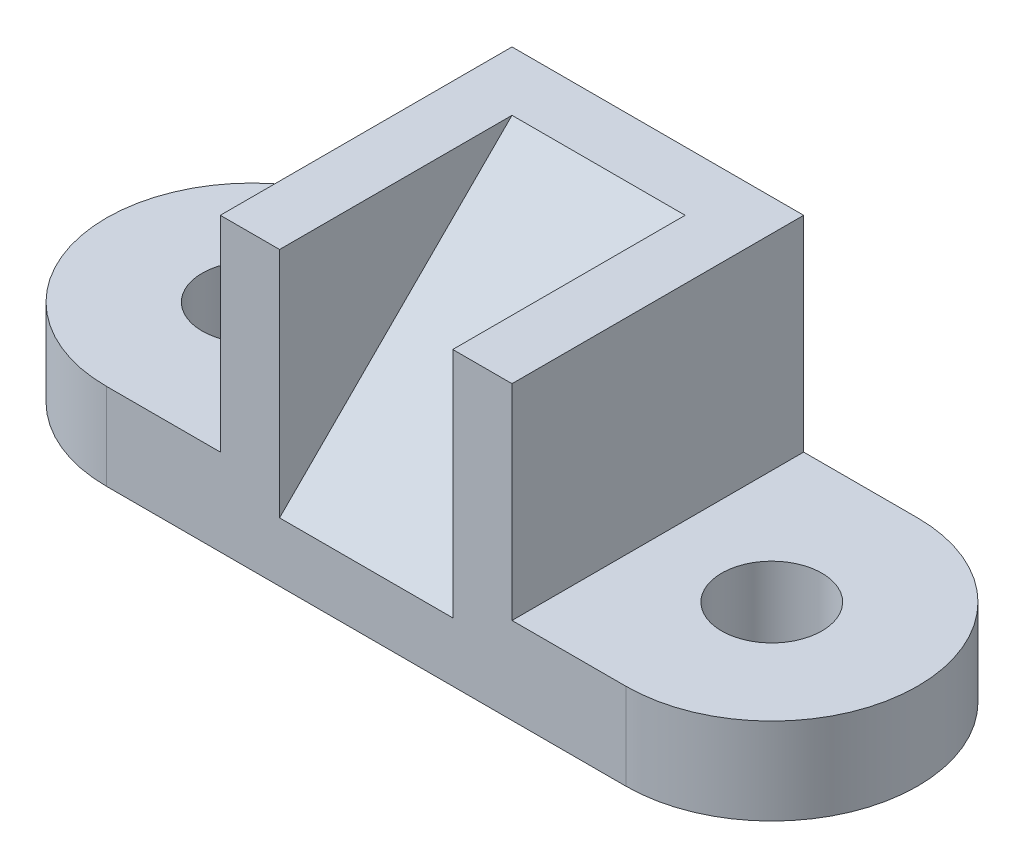
ISO-10303-21;
HEADER;
FILE_DESCRIPTION(('STEP AP214'),'2;1');
FILE_NAME('part.step','',(''),(''),'','','');
FILE_SCHEMA(('AUTOMOTIVE_DESIGN { 1 0 10303 214 1 1 1 1 }'));
ENDSEC;
DATA;
#1=APPLICATION_CONTEXT('core data for automotive mechanical design processes');
#2=APPLICATION_PROTOCOL_DEFINITION('international standard','automotive_design',2000,#1);
#3=PRODUCT_CONTEXT('',#1,'mechanical');
#4=PRODUCT('Part','Part','',(#3));
#5=PRODUCT_RELATED_PRODUCT_CATEGORY('part','',(#4));
#6=PRODUCT_DEFINITION_FORMATION('','',#4);
#7=PRODUCT_DEFINITION_CONTEXT('part definition',#1,'design');
#8=PRODUCT_DEFINITION('design','',#6,#7);
#9=PRODUCT_DEFINITION_SHAPE('','',#8);
#10=(LENGTH_UNIT() NAMED_UNIT(*) SI_UNIT(.MILLI.,.METRE.));
#11=(NAMED_UNIT(*) PLANE_ANGLE_UNIT() SI_UNIT($,.RADIAN.));
#12=(NAMED_UNIT(*) SI_UNIT($,.STERADIAN.) SOLID_ANGLE_UNIT());
#13=UNCERTAINTY_MEASURE_WITH_UNIT(LENGTH_MEASURE(1.E-05),#10,'distance_accuracy_value','');
#14=(GEOMETRIC_REPRESENTATION_CONTEXT(3) GLOBAL_UNCERTAINTY_ASSIGNED_CONTEXT((#13)) GLOBAL_UNIT_ASSIGNED_CONTEXT((#10,
#11,#12)) REPRESENTATION_CONTEXT('',''));
#15=CARTESIAN_POINT('',(0.,0.,0.));
#16=DIRECTION('',(0.,0.,1.));
#17=DIRECTION('',(1.,0.,0.));
#18=AXIS2_PLACEMENT_3D('',#15,#16,#17);
#19=CARTESIAN_POINT('',(-19.,13.,32.));
#20=DIRECTION('',(-1.,0.,0.));
#21=DIRECTION('',(0.,0.,1.));
#22=AXIS2_PLACEMENT_3D('',#19,#20,#21);
#23=PLANE('',#22);
#24=DIRECTION('',(0.,0.707106781186547,-0.707106781186548));
#25=VECTOR('',#24,1.);
#26=CARTESIAN_POINT('',(-19.,64.,-19.));
#27=LINE('',#26,#25);
#28=CARTESIAN_POINT('',(-19.,13.,32.));
#29=VERTEX_POINT('',#28);
#30=CARTESIAN_POINT('',(-19.,64.,-19.));
#31=VERTEX_POINT('',#30);
#32=EDGE_CURVE('E143',#29,#31,#27,.T.);
#33=ORIENTED_EDGE('',*,*,#32,.T.);
#34=DIRECTION('',(0.,0.,1.));
#35=VECTOR('',#34,1.);
#36=CARTESIAN_POINT('',(-19.,64.,32.));
#37=LINE('',#36,#35);
#38=CARTESIAN_POINT('',(-19.,64.,32.));
#39=VERTEX_POINT('',#38);
#40=EDGE_CURVE('E152',#31,#39,#37,.T.);
#41=ORIENTED_EDGE('',*,*,#40,.T.);
#42=DIRECTION('',(0.,1.,0.));
#43=VECTOR('',#42,1.);
#44=CARTESIAN_POINT('',(-19.,13.,32.));
#45=LINE('',#44,#43);
#46=EDGE_CURVE('E134',#29,#39,#45,.T.);
#47=ORIENTED_EDGE('',*,*,#46,.F.);
#48=EDGE_LOOP('',(#33,#41,#47));
#49=FACE_BOUND('',#48,.T.);
#50=ADVANCED_FACE('F43',(#49),#23,.F.);
#51=CARTESIAN_POINT('',(19.,13.,32.));
#52=DIRECTION('',(1.,0.,0.));
#53=DIRECTION('',(0.,0.,-1.));
#54=AXIS2_PLACEMENT_3D('',#51,#52,#53);
#55=PLANE('',#54);
#56=DIRECTION('',(0.,0.707106781186547,-0.707106781186548));
#57=VECTOR('',#56,1.);
#58=CARTESIAN_POINT('',(19.,64.,-19.));
#59=LINE('',#58,#57);
#60=CARTESIAN_POINT('',(19.,13.,32.));
#61=VERTEX_POINT('',#60);
#62=CARTESIAN_POINT('',(19.,64.,-19.));
#63=VERTEX_POINT('',#62);
#64=EDGE_CURVE('E137',#61,#63,#59,.T.);
#65=ORIENTED_EDGE('',*,*,#64,.F.);
#66=DIRECTION('',(0.,1.,0.));
#67=VECTOR('',#66,1.);
#68=CARTESIAN_POINT('',(19.,13.,32.));
#69=LINE('',#68,#67);
#70=CARTESIAN_POINT('',(19.,64.,32.));
#71=VERTEX_POINT('',#70);
#72=EDGE_CURVE('E58',#61,#71,#69,.T.);
#73=ORIENTED_EDGE('',*,*,#72,.T.);
#74=DIRECTION('',(0.,0.,-1.));
#75=VECTOR('',#74,1.);
#76=CARTESIAN_POINT('',(19.,64.,32.));
#77=LINE('',#76,#75);
#78=EDGE_CURVE('E139',#71,#63,#77,.T.);
#79=ORIENTED_EDGE('',*,*,#78,.T.);
#80=EDGE_LOOP('',(#65,#73,#79));
#81=FACE_BOUND('',#80,.T.);
#82=ADVANCED_FACE('F138',(#81),#55,.F.);
#83=CARTESIAN_POINT('',(0.,19.,0.));
#84=DIRECTION('',(0.,1.,0.));
#85=DIRECTION('',(0.,0.,1.));
#86=AXIS2_PLACEMENT_3D('',#83,#84,#85);
#87=PLANE('',#86);
#88=DIRECTION('',(0.,0.,1.));
#89=VECTOR('',#88,1.);
#90=CARTESIAN_POINT('',(-32.,19.,-32.));
#91=LINE('',#90,#89);
#92=CARTESIAN_POINT('',(-32.,19.,-32.));
#93=VERTEX_POINT('',#92);
#94=CARTESIAN_POINT('',(-32.,19.,32.));
#95=VERTEX_POINT('',#94);
#96=EDGE_CURVE('E133',#93,#95,#91,.T.);
#97=ORIENTED_EDGE('',*,*,#96,.F.);
#98=DIRECTION('',(-1.,0.,0.));
#99=VECTOR('',#98,1.);
#100=CARTESIAN_POINT('',(0.,19.,-32.));
#101=LINE('',#100,#99);
#102=CARTESIAN_POINT('',(-57.,19.,-32.));
#103=VERTEX_POINT('',#102);
#104=EDGE_CURVE('E184',#93,#103,#101,.T.);
#105=ORIENTED_EDGE('',*,*,#104,.T.);
#106=CARTESIAN_POINT('',(-57.,19.,0.));
#107=DIRECTION('',(0.,1.,0.));
#108=DIRECTION('',(0.,0.,1.));
#109=AXIS2_PLACEMENT_3D('',#106,#107,#108);
#110=CIRCLE('',#109,32.);
#111=CARTESIAN_POINT('',(-57.,19.,32.));
#112=VERTEX_POINT('',#111);
#113=EDGE_CURVE('E188',#103,#112,#110,.T.);
#114=ORIENTED_EDGE('',*,*,#113,.T.);
#115=DIRECTION('',(1.,0.,0.));
#116=VECTOR('',#115,1.);
#117=CARTESIAN_POINT('',(0.,19.,32.));
#118=LINE('',#117,#116);
#119=EDGE_CURVE('E191',#112,#95,#118,.T.);
#120=ORIENTED_EDGE('',*,*,#119,.T.);
#121=EDGE_LOOP('',(#97,#105,#114,#120));
#122=FACE_BOUND('',#121,.T.);
#123=CARTESIAN_POINT('',(-57.,19.,0.));
#124=DIRECTION('',(0.,1.,0.));
#125=DIRECTION('',(0.,0.,1.));
#126=AXIS2_PLACEMENT_3D('',#123,#124,#125);
#127=CIRCLE('',#126,11.);
#128=CARTESIAN_POINT('',(-57.,19.,11.));
#129=VERTEX_POINT('',#128);
#130=EDGE_CURVE('E181',#129,#129,#127,.T.);
#131=ORIENTED_EDGE('',*,*,#130,.F.);
#132=EDGE_LOOP('',(#131));
#133=FACE_BOUND('',#132,.T.);
#134=ADVANCED_FACE('F249',(#122,#133),#87,.T.);
#135=CARTESIAN_POINT('',(0.,19.,-32.));
#136=DIRECTION('',(0.,0.,1.));
#137=DIRECTION('',(1.,0.,0.));
#138=AXIS2_PLACEMENT_3D('',#135,#136,#137);
#139=PLANE('',#138);
#140=DIRECTION('',(-1.,0.,0.));
#141=VECTOR('',#140,1.);
#142=CARTESIAN_POINT('',(0.,0.,-32.));
#143=LINE('',#142,#141);
#144=CARTESIAN_POINT('',(57.,0.,-32.));
#145=VERTEX_POINT('',#144);
#146=CARTESIAN_POINT('',(-57.,0.,-32.));
#147=VERTEX_POINT('',#146);
#148=EDGE_CURVE('E202',#145,#147,#143,.T.);
#149=ORIENTED_EDGE('',*,*,#148,.T.);
#150=DIRECTION('',(0.,-1.,0.));
#151=VECTOR('',#150,1.);
#152=CARTESIAN_POINT('',(-57.,19.,-32.));
#153=LINE('',#152,#151);
#154=EDGE_CURVE('E11',#103,#147,#153,.T.);
#155=ORIENTED_EDGE('',*,*,#154,.F.);
#156=ORIENTED_EDGE('',*,*,#104,.F.);
#157=DIRECTION('',(0.,-1.,0.));
#158=VECTOR('',#157,1.);
#159=CARTESIAN_POINT('',(-32.,64.,-32.));
#160=LINE('',#159,#158);
#161=CARTESIAN_POINT('',(-32.,64.,-32.));
#162=VERTEX_POINT('',#161);
#163=EDGE_CURVE('E165',#162,#93,#160,.T.);
#164=ORIENTED_EDGE('',*,*,#163,.F.);
#165=DIRECTION('',(-1.,0.,0.));
#166=VECTOR('',#165,1.);
#167=CARTESIAN_POINT('',(-32.,64.,-32.));
#168=LINE('',#167,#166);
#169=CARTESIAN_POINT('',(32.,64.,-32.));
#170=VERTEX_POINT('',#169);
#171=EDGE_CURVE('E163',#170,#162,#168,.T.);
#172=ORIENTED_EDGE('',*,*,#171,.F.);
#173=DIRECTION('',(0.,-1.,0.));
#174=VECTOR('',#173,1.);
#175=CARTESIAN_POINT('',(32.,64.,-32.));
#176=LINE('',#175,#174);
#177=CARTESIAN_POINT('',(32.,19.,-32.));
#178=VERTEX_POINT('',#177);
#179=EDGE_CURVE('E171',#170,#178,#176,.T.);
#180=ORIENTED_EDGE('',*,*,#179,.T.);
#181=CARTESIAN_POINT('',(57.,19.,-32.));
#182=VERTEX_POINT('',#181);
#183=EDGE_CURVE('E186',#182,#178,#101,.T.);
#184=ORIENTED_EDGE('',*,*,#183,.F.);
#185=DIRECTION('',(0.,-1.,0.));
#186=VECTOR('',#185,1.);
#187=CARTESIAN_POINT('',(57.,19.,-32.));
#188=LINE('',#187,#186);
#189=EDGE_CURVE('E199',#182,#145,#188,.T.);
#190=ORIENTED_EDGE('',*,*,#189,.T.);
#191=EDGE_LOOP('',(#149,#155,#156,#164,#172,#180,#184,#190));
#192=FACE_BOUND('',#191,.T.);
#193=ADVANCED_FACE('F253',(#192),#139,.F.);
#194=CARTESIAN_POINT('',(-57.,19.,0.));
#195=DIRECTION('',(0.,-1.,0.));
#196=DIRECTION('',(0.,0.,-1.));
#197=AXIS2_PLACEMENT_3D('',#194,#195,#196);
#198=CYLINDRICAL_SURFACE('',#197,32.);
#199=CARTESIAN_POINT('',(-57.,0.,0.));
#200=DIRECTION('',(0.,1.,0.));
#201=DIRECTION('',(0.,0.,1.));
#202=AXIS2_PLACEMENT_3D('',#199,#200,#201);
#203=CIRCLE('',#202,32.);
#204=CARTESIAN_POINT('',(-57.,0.,32.));
#205=VERTEX_POINT('',#204);
#206=EDGE_CURVE('E205',#147,#205,#203,.T.);
#207=ORIENTED_EDGE('',*,*,#206,.T.);
#208=DIRECTION('',(0.,-1.,0.));
#209=VECTOR('',#208,1.);
#210=CARTESIAN_POINT('',(-57.,19.,32.));
#211=LINE('',#210,#209);
#212=EDGE_CURVE('E51',#112,#205,#211,.T.);
#213=ORIENTED_EDGE('',*,*,#212,.F.);
#214=ORIENTED_EDGE('',*,*,#113,.F.);
#215=ORIENTED_EDGE('',*,*,#154,.T.);
#216=EDGE_LOOP('',(#207,#213,#214,#215));
#217=FACE_BOUND('',#216,.T.);
#218=ADVANCED_FACE('F254',(#217),#198,.T.);
#219=CARTESIAN_POINT('',(0.,19.,32.));
#220=DIRECTION('',(0.,0.,-1.));
#221=DIRECTION('',(-1.,0.,0.));
#222=AXIS2_PLACEMENT_3D('',#219,#220,#221);
#223=PLANE('',#222);
#224=DIRECTION('',(1.,0.,0.));
#225=VECTOR('',#224,1.);
#226=CARTESIAN_POINT('',(-19.,13.,32.));
#227=LINE('',#226,#225);
#228=EDGE_CURVE('E129',#29,#61,#227,.T.);
#229=ORIENTED_EDGE('',*,*,#228,.F.);
#230=ORIENTED_EDGE('',*,*,#46,.T.);
#231=DIRECTION('',(1.,0.,0.));
#232=VECTOR('',#231,1.);
#233=CARTESIAN_POINT('',(-32.,64.,32.));
#234=LINE('',#233,#232);
#235=CARTESIAN_POINT('',(-32.,64.,32.));
#236=VERTEX_POINT('',#235);
#237=EDGE_CURVE('E158',#236,#39,#234,.T.);
#238=ORIENTED_EDGE('',*,*,#237,.F.);
#239=DIRECTION('',(0.,-1.,0.));
#240=VECTOR('',#239,1.);
#241=CARTESIAN_POINT('',(-32.,64.,32.));
#242=LINE('',#241,#240);
#243=EDGE_CURVE('E177',#236,#95,#242,.T.);
#244=ORIENTED_EDGE('',*,*,#243,.T.);
#245=ORIENTED_EDGE('',*,*,#119,.F.);
#246=ORIENTED_EDGE('',*,*,#212,.T.);
#247=DIRECTION('',(1.,0.,0.));
#248=VECTOR('',#247,1.);
#249=CARTESIAN_POINT('',(0.,0.,32.));
#250=LINE('',#249,#248);
#251=CARTESIAN_POINT('',(57.,0.,32.));
#252=VERTEX_POINT('',#251);
#253=EDGE_CURVE('E207',#205,#252,#250,.T.);
#254=ORIENTED_EDGE('',*,*,#253,.T.);
#255=DIRECTION('',(0.,-1.,0.));
#256=VECTOR('',#255,1.);
#257=CARTESIAN_POINT('',(57.,19.,32.));
#258=LINE('',#257,#256);
#259=CARTESIAN_POINT('',(57.,19.,32.));
#260=VERTEX_POINT('',#259);
#261=EDGE_CURVE('E216',#260,#252,#258,.T.);
#262=ORIENTED_EDGE('',*,*,#261,.F.);
#263=CARTESIAN_POINT('',(32.,19.,32.));
#264=VERTEX_POINT('',#263);
#265=EDGE_CURVE('E190',#264,#260,#118,.T.);
#266=ORIENTED_EDGE('',*,*,#265,.F.);
#267=DIRECTION('',(0.,-1.,0.));
#268=VECTOR('',#267,1.);
#269=CARTESIAN_POINT('',(32.,64.,32.));
#270=LINE('',#269,#268);
#271=CARTESIAN_POINT('',(32.,64.,32.));
#272=VERTEX_POINT('',#271);
#273=EDGE_CURVE('E174',#272,#264,#270,.T.);
#274=ORIENTED_EDGE('',*,*,#273,.F.);
#275=EDGE_CURVE('E132',#71,#272,#234,.T.);
#276=ORIENTED_EDGE('',*,*,#275,.F.);
#277=ORIENTED_EDGE('',*,*,#72,.F.);
#278=EDGE_LOOP('',(#229,#230,#238,#244,#245,#246,#254,#262,#266,#274,#276,#277));
#279=FACE_BOUND('',#278,.T.);
#280=ADVANCED_FACE('F126',(#279),#223,.F.);
#281=CARTESIAN_POINT('',(57.,19.,0.));
#282=DIRECTION('',(0.,-1.,0.));
#283=DIRECTION('',(0.,0.,-1.));
#284=AXIS2_PLACEMENT_3D('',#281,#282,#283);
#285=CYLINDRICAL_SURFACE('',#284,32.);
#286=CARTESIAN_POINT('',(57.,0.,0.));
#287=DIRECTION('',(0.,1.,0.));
#288=DIRECTION('',(0.,0.,1.));
#289=AXIS2_PLACEMENT_3D('',#286,#287,#288);
#290=CIRCLE('',#289,32.);
#291=EDGE_CURVE('E210',#145,#252,#290,.F.);
#292=ORIENTED_EDGE('',*,*,#291,.F.);
#293=ORIENTED_EDGE('',*,*,#189,.F.);
#294=CARTESIAN_POINT('',(57.,19.,0.));
#295=DIRECTION('',(0.,1.,0.));
#296=DIRECTION('',(0.,0.,1.));
#297=AXIS2_PLACEMENT_3D('',#294,#295,#296);
#298=CIRCLE('',#297,32.);
#299=EDGE_CURVE('E193',#182,#260,#298,.F.);
#300=ORIENTED_EDGE('',*,*,#299,.T.);
#301=ORIENTED_EDGE('',*,*,#261,.T.);
#302=EDGE_LOOP('',(#292,#293,#300,#301));
#303=FACE_BOUND('',#302,.T.);
#304=ADVANCED_FACE('F230',(#303),#285,.T.);
#305=CARTESIAN_POINT('',(-57.,19.,0.));
#306=DIRECTION('',(0.,-1.,0.));
#307=DIRECTION('',(0.,0.,-1.));
#308=AXIS2_PLACEMENT_3D('',#305,#306,#307);
#309=CYLINDRICAL_SURFACE('',#308,11.);
#310=ORIENTED_EDGE('',*,*,#130,.T.);
#311=EDGE_LOOP('',(#310));
#312=FACE_BOUND('',#311,.T.);
#313=CARTESIAN_POINT('',(-57.,0.,0.));
#314=DIRECTION('',(0.,1.,0.));
#315=DIRECTION('',(0.,0.,1.));
#316=AXIS2_PLACEMENT_3D('',#313,#314,#315);
#317=CIRCLE('',#316,11.);
#318=CARTESIAN_POINT('',(-57.,0.,11.));
#319=VERTEX_POINT('',#318);
#320=EDGE_CURVE('E180',#319,#319,#317,.T.);
#321=ORIENTED_EDGE('',*,*,#320,.F.);
#322=EDGE_LOOP('',(#321));
#323=FACE_BOUND('',#322,.T.);
#324=ADVANCED_FACE('F45',(#312,#323),#309,.F.);
#325=CARTESIAN_POINT('',(57.,19.,0.));
#326=DIRECTION('',(0.,-1.,0.));
#327=DIRECTION('',(0.,0.,-1.));
#328=AXIS2_PLACEMENT_3D('',#325,#326,#327);
#329=CYLINDRICAL_SURFACE('',#328,11.);
#330=CARTESIAN_POINT('',(57.,19.,0.));
#331=DIRECTION('',(0.,1.,0.));
#332=DIRECTION('',(0.,0.,1.));
#333=AXIS2_PLACEMENT_3D('',#330,#331,#332);
#334=CIRCLE('',#333,11.);
#335=CARTESIAN_POINT('',(57.,19.,11.));
#336=VERTEX_POINT('',#335);
#337=EDGE_CURVE('E196',#336,#336,#334,.F.);
#338=ORIENTED_EDGE('',*,*,#337,.F.);
#339=EDGE_LOOP('',(#338));
#340=FACE_BOUND('',#339,.T.);
#341=CARTESIAN_POINT('',(57.,0.,0.));
#342=DIRECTION('',(0.,1.,0.));
#343=DIRECTION('',(0.,0.,1.));
#344=AXIS2_PLACEMENT_3D('',#341,#342,#343);
#345=CIRCLE('',#344,11.);
#346=CARTESIAN_POINT('',(57.,0.,11.));
#347=VERTEX_POINT('',#346);
#348=EDGE_CURVE('E185',#347,#347,#345,.F.);
#349=ORIENTED_EDGE('',*,*,#348,.T.);
#350=EDGE_LOOP('',(#349));
#351=FACE_BOUND('',#350,.T.);
#352=ADVANCED_FACE('F280',(#340,#351),#329,.F.);
#353=DIRECTION('',(0.,0.,-1.));
#354=VECTOR('',#353,1.);
#355=CARTESIAN_POINT('',(32.,19.,-32.));
#356=LINE('',#355,#354);
#357=EDGE_CURVE('E66',#264,#178,#356,.T.);
#358=ORIENTED_EDGE('',*,*,#357,.F.);
#359=ORIENTED_EDGE('',*,*,#265,.T.);
#360=ORIENTED_EDGE('',*,*,#299,.F.);
#361=ORIENTED_EDGE('',*,*,#183,.T.);
#362=EDGE_LOOP('',(#358,#359,#360,#361));
#363=FACE_BOUND('',#362,.T.);
#364=ORIENTED_EDGE('',*,*,#337,.T.);
#365=EDGE_LOOP('',(#364));
#366=FACE_BOUND('',#365,.T.);
#367=ADVANCED_FACE('F277',(#363,#366),#87,.T.);
#368=CARTESIAN_POINT('',(0.,0.,0.));
#369=DIRECTION('',(0.,1.,0.));
#370=DIRECTION('',(0.,0.,1.));
#371=AXIS2_PLACEMENT_3D('',#368,#369,#370);
#372=PLANE('',#371);
#373=ORIENTED_EDGE('',*,*,#320,.T.);
#374=EDGE_LOOP('',(#373));
#375=FACE_BOUND('',#374,.T.);
#376=ORIENTED_EDGE('',*,*,#148,.F.);
#377=ORIENTED_EDGE('',*,*,#291,.T.);
#378=ORIENTED_EDGE('',*,*,#253,.F.);
#379=ORIENTED_EDGE('',*,*,#206,.F.);
#380=EDGE_LOOP('',(#376,#377,#378,#379));
#381=FACE_BOUND('',#380,.T.);
#382=ORIENTED_EDGE('',*,*,#348,.F.);
#383=EDGE_LOOP('',(#382));
#384=FACE_BOUND('',#383,.T.);
#385=ADVANCED_FACE('F226',(#375,#381,#384),#372,.F.);
#386=CARTESIAN_POINT('',(-32.,64.,-32.));
#387=DIRECTION('',(1.,0.,0.));
#388=DIRECTION('',(0.,0.,-1.));
#389=AXIS2_PLACEMENT_3D('',#386,#387,#388);
#390=PLANE('',#389);
#391=ORIENTED_EDGE('',*,*,#96,.T.);
#392=ORIENTED_EDGE('',*,*,#243,.F.);
#393=DIRECTION('',(0.,0.,1.));
#394=VECTOR('',#393,1.);
#395=CARTESIAN_POINT('',(-32.,64.,-32.));
#396=LINE('',#395,#394);
#397=EDGE_CURVE('E155',#162,#236,#396,.T.);
#398=ORIENTED_EDGE('',*,*,#397,.F.);
#399=ORIENTED_EDGE('',*,*,#163,.T.);
#400=EDGE_LOOP('',(#391,#392,#398,#399));
#401=FACE_BOUND('',#400,.T.);
#402=ADVANCED_FACE('F246',(#401),#390,.F.);
#403=CARTESIAN_POINT('',(32.,64.,-32.));
#404=DIRECTION('',(-1.,0.,0.));
#405=DIRECTION('',(0.,0.,1.));
#406=AXIS2_PLACEMENT_3D('',#403,#404,#405);
#407=PLANE('',#406);
#408=ORIENTED_EDGE('',*,*,#357,.T.);
#409=ORIENTED_EDGE('',*,*,#179,.F.);
#410=DIRECTION('',(0.,0.,-1.));
#411=VECTOR('',#410,1.);
#412=CARTESIAN_POINT('',(32.,64.,-32.));
#413=LINE('',#412,#411);
#414=EDGE_CURVE('E161',#272,#170,#413,.T.);
#415=ORIENTED_EDGE('',*,*,#414,.F.);
#416=ORIENTED_EDGE('',*,*,#273,.T.);
#417=EDGE_LOOP('',(#408,#409,#415,#416));
#418=FACE_BOUND('',#417,.T.);
#419=ADVANCED_FACE('F235',(#418),#407,.F.);
#420=CARTESIAN_POINT('',(0.,64.,0.));
#421=DIRECTION('',(0.,1.,0.));
#422=DIRECTION('',(0.,0.,1.));
#423=AXIS2_PLACEMENT_3D('',#420,#421,#422);
#424=PLANE('',#423);
#425=ORIENTED_EDGE('',*,*,#40,.F.);
#426=DIRECTION('',(-1.,0.,0.));
#427=VECTOR('',#426,1.);
#428=CARTESIAN_POINT('',(-19.,64.,-19.));
#429=LINE('',#428,#427);
#430=EDGE_CURVE('E146',#63,#31,#429,.T.);
#431=ORIENTED_EDGE('',*,*,#430,.F.);
#432=ORIENTED_EDGE('',*,*,#78,.F.);
#433=ORIENTED_EDGE('',*,*,#275,.T.);
#434=ORIENTED_EDGE('',*,*,#414,.T.);
#435=ORIENTED_EDGE('',*,*,#171,.T.);
#436=ORIENTED_EDGE('',*,*,#397,.T.);
#437=ORIENTED_EDGE('',*,*,#237,.T.);
#438=EDGE_LOOP('',(#425,#431,#432,#433,#434,#435,#436,#437));
#439=FACE_BOUND('',#438,.T.);
#440=ADVANCED_FACE('F240',(#439),#424,.T.);
#441=CARTESIAN_POINT('',(-19.,64.,-19.));
#442=DIRECTION('',(0.,-0.707106781186548,-0.707106781186547));
#443=DIRECTION('',(0.,0.707106781186547,-0.707106781186548));
#444=AXIS2_PLACEMENT_3D('',#441,#442,#443);
#445=PLANE('',#444);
#446=ORIENTED_EDGE('',*,*,#64,.T.);
#447=ORIENTED_EDGE('',*,*,#430,.T.);
#448=ORIENTED_EDGE('',*,*,#32,.F.);
#449=ORIENTED_EDGE('',*,*,#228,.T.);
#450=EDGE_LOOP('',(#446,#447,#448,#449));
#451=FACE_BOUND('',#450,.T.);
#452=ADVANCED_FACE('F145',(#451),#445,.F.);
#453=CLOSED_SHELL('',(#50,#82,#134,#193,#218,#280,#304,#324,#352,#367,#385,#402,#419,#440,#452));
#454=MANIFOLD_SOLID_BREP('B2',#453);
#455=ADVANCED_BREP_SHAPE_REPRESENTATION('',(#18,#454),#14);
#456=SHAPE_DEFINITION_REPRESENTATION(#9,#455);
ENDSEC;
END-ISO-10303-21;
